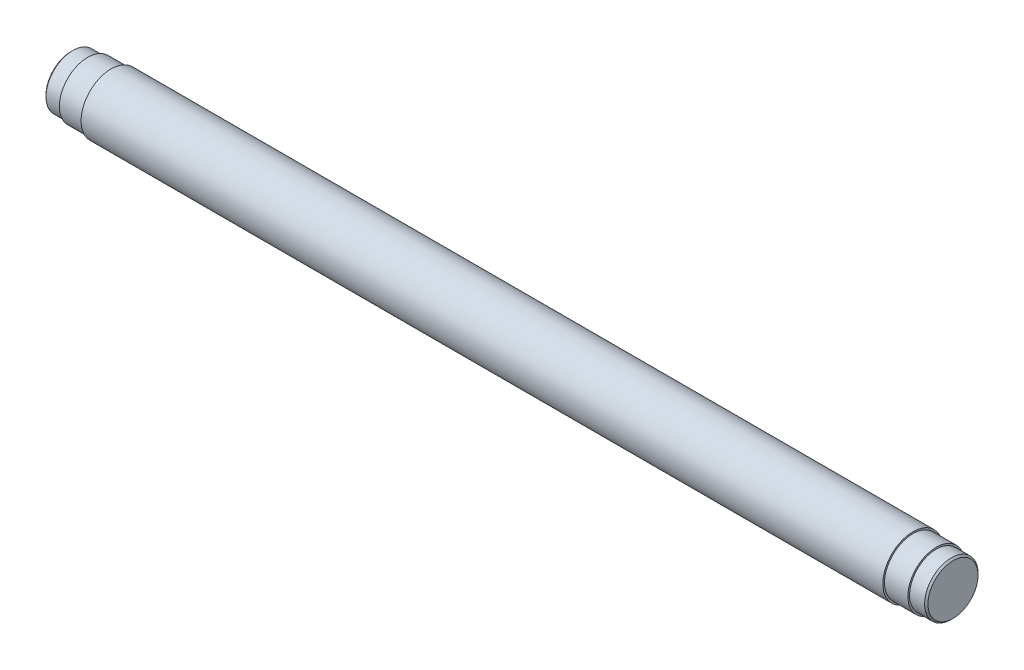
ISO-10303-21;
HEADER;
FILE_DESCRIPTION(('STEP AP214'),'2;1');
FILE_NAME('part.step','',(''),(''),'','','');
FILE_SCHEMA(('AUTOMOTIVE_DESIGN { 1 0 10303 214 1 1 1 1 }'));
ENDSEC;
DATA;
#1=APPLICATION_CONTEXT('core data for automotive mechanical design processes');
#2=APPLICATION_PROTOCOL_DEFINITION('international standard','automotive_design',2000,#1);
#3=PRODUCT_CONTEXT('',#1,'mechanical');
#4=PRODUCT('Part','Part','',(#3));
#5=PRODUCT_RELATED_PRODUCT_CATEGORY('part','',(#4));
#6=PRODUCT_DEFINITION_FORMATION('','',#4);
#7=PRODUCT_DEFINITION_CONTEXT('part definition',#1,'design');
#8=PRODUCT_DEFINITION('design','',#6,#7);
#9=PRODUCT_DEFINITION_SHAPE('','',#8);
#10=(LENGTH_UNIT() NAMED_UNIT(*) SI_UNIT(.MILLI.,.METRE.));
#11=(NAMED_UNIT(*) PLANE_ANGLE_UNIT() SI_UNIT($,.RADIAN.));
#12=(NAMED_UNIT(*) SI_UNIT($,.STERADIAN.) SOLID_ANGLE_UNIT());
#13=UNCERTAINTY_MEASURE_WITH_UNIT(LENGTH_MEASURE(1.E-05),#10,'distance_accuracy_value','');
#14=(GEOMETRIC_REPRESENTATION_CONTEXT(3) GLOBAL_UNCERTAINTY_ASSIGNED_CONTEXT((#13)) GLOBAL_UNIT_ASSIGNED_CONTEXT((#10,
#11,#12)) REPRESENTATION_CONTEXT('',''));
#15=CARTESIAN_POINT('',(0.,0.,0.));
#16=DIRECTION('',(0.,0.,1.));
#17=DIRECTION('',(1.,0.,0.));
#18=AXIS2_PLACEMENT_3D('',#15,#16,#17);
#19=CARTESIAN_POINT('',(0.,0.,0.));
#20=DIRECTION('',(1.,0.,0.));
#21=DIRECTION('',(0.,0.,-1.));
#22=AXIS2_PLACEMENT_3D('',#19,#20,#21);
#23=PLANE('',#22);
#24=CARTESIAN_POINT('',(0.,0.,0.));
#25=DIRECTION('',(1.,0.,0.));
#26=DIRECTION('',(0.,0.,-1.));
#27=AXIS2_PLACEMENT_3D('',#24,#25,#26);
#28=CIRCLE('',#27,7.50000000000006);
#29=CARTESIAN_POINT('',(0.,0.,-7.50000000000006));
#30=VERTEX_POINT('',#29);
#31=EDGE_CURVE('E39',#30,#30,#28,.F.);
#32=ORIENTED_EDGE('',*,*,#31,.T.);
#33=EDGE_LOOP('',(#32));
#34=FACE_BOUND('',#33,.T.);
#35=ADVANCED_FACE('F32',(#34),#23,.F.);
#36=CARTESIAN_POINT('',(-102.487167665038,0.,0.));
#37=DIRECTION('',(-1.,0.,0.));
#38=DIRECTION('',(0.,0.,1.));
#39=AXIS2_PLACEMENT_3D('',#36,#37,#38);
#40=CYLINDRICAL_SURFACE('',#39,8.00000000000001);
#41=CARTESIAN_POINT('',(0.499999999999973,0.,0.));
#42=DIRECTION('',(1.,0.,0.));
#43=DIRECTION('',(0.,0.,-1.));
#44=AXIS2_PLACEMENT_3D('',#41,#42,#43);
#45=CIRCLE('',#44,8.00000000000001);
#46=CARTESIAN_POINT('',(0.499999999999973,0.,-8.00000000000001));
#47=VERTEX_POINT('',#46);
#48=EDGE_CURVE('E10',#47,#47,#45,.T.);
#49=ORIENTED_EDGE('',*,*,#48,.T.);
#50=EDGE_LOOP('',(#49));
#51=FACE_BOUND('',#50,.T.);
#52=CARTESIAN_POINT('',(5.,0.,0.));
#53=DIRECTION('',(-1.,0.,0.));
#54=DIRECTION('',(0.,0.,1.));
#55=AXIS2_PLACEMENT_3D('',#52,#53,#54);
#56=CIRCLE('',#55,8.00000000000001);
#57=CARTESIAN_POINT('',(5.,0.,8.00000000000001));
#58=VERTEX_POINT('',#57);
#59=EDGE_CURVE('E52',#58,#58,#56,.T.);
#60=ORIENTED_EDGE('',*,*,#59,.T.);
#61=EDGE_LOOP('',(#60));
#62=FACE_BOUND('',#61,.T.);
#63=ADVANCED_FACE('F95',(#51,#62),#40,.T.);
#64=CARTESIAN_POINT('',(5.,0.,-8.00000000000001));
#65=DIRECTION('',(1.,0.,0.));
#66=DIRECTION('',(0.,0.,-1.));
#67=AXIS2_PLACEMENT_3D('',#64,#65,#66);
#68=PLANE('',#67);
#69=ORIENTED_EDGE('',*,*,#59,.F.);
#70=EDGE_LOOP('',(#69));
#71=FACE_BOUND('',#70,.T.);
#72=CARTESIAN_POINT('',(5.,0.,0.));
#73=DIRECTION('',(-1.,0.,0.));
#74=DIRECTION('',(0.,0.,1.));
#75=AXIS2_PLACEMENT_3D('',#72,#73,#74);
#76=CIRCLE('',#75,8.5);
#77=CARTESIAN_POINT('',(5.,0.,8.5));
#78=VERTEX_POINT('',#77);
#79=EDGE_CURVE('E55',#78,#78,#76,.T.);
#80=ORIENTED_EDGE('',*,*,#79,.T.);
#81=EDGE_LOOP('',(#80));
#82=FACE_BOUND('',#81,.T.);
#83=ADVANCED_FACE('F100',(#71,#82),#68,.F.);
#84=CARTESIAN_POINT('',(-102.487167665038,0.,0.));
#85=DIRECTION('',(-1.,0.,0.));
#86=DIRECTION('',(0.,0.,1.));
#87=AXIS2_PLACEMENT_3D('',#84,#85,#86);
#88=CYLINDRICAL_SURFACE('',#87,8.5);
#89=ORIENTED_EDGE('',*,*,#79,.F.);
#90=EDGE_LOOP('',(#89));
#91=FACE_BOUND('',#90,.T.);
#92=CARTESIAN_POINT('',(12.,0.,0.));
#93=DIRECTION('',(-1.,0.,0.));
#94=DIRECTION('',(0.,0.,1.));
#95=AXIS2_PLACEMENT_3D('',#92,#93,#94);
#96=CIRCLE('',#95,8.5);
#97=CARTESIAN_POINT('',(12.,0.,8.5));
#98=VERTEX_POINT('',#97);
#99=EDGE_CURVE('E58',#98,#98,#96,.T.);
#100=ORIENTED_EDGE('',*,*,#99,.T.);
#101=EDGE_LOOP('',(#100));
#102=FACE_BOUND('',#101,.T.);
#103=ADVANCED_FACE('F186',(#91,#102),#88,.T.);
#104=CARTESIAN_POINT('',(12.,0.,-8.5));
#105=DIRECTION('',(1.,0.,0.));
#106=DIRECTION('',(0.,0.,-1.));
#107=AXIS2_PLACEMENT_3D('',#104,#105,#106);
#108=PLANE('',#107);
#109=ORIENTED_EDGE('',*,*,#99,.F.);
#110=EDGE_LOOP('',(#109));
#111=FACE_BOUND('',#110,.T.);
#112=CARTESIAN_POINT('',(12.,0.,0.));
#113=DIRECTION('',(-1.,0.,0.));
#114=DIRECTION('',(0.,0.,1.));
#115=AXIS2_PLACEMENT_3D('',#112,#113,#114);
#116=CIRCLE('',#115,9.);
#117=CARTESIAN_POINT('',(12.,0.,9.));
#118=VERTEX_POINT('',#117);
#119=EDGE_CURVE('E61',#118,#118,#116,.T.);
#120=ORIENTED_EDGE('',*,*,#119,.T.);
#121=EDGE_LOOP('',(#120));
#122=FACE_BOUND('',#121,.T.);
#123=ADVANCED_FACE('F176',(#111,#122),#108,.F.);
#124=CARTESIAN_POINT('',(-102.487167665038,0.,0.));
#125=DIRECTION('',(-1.,0.,0.));
#126=DIRECTION('',(0.,0.,1.));
#127=AXIS2_PLACEMENT_3D('',#124,#125,#126);
#128=CYLINDRICAL_SURFACE('',#127,9.);
#129=ORIENTED_EDGE('',*,*,#119,.F.);
#130=EDGE_LOOP('',(#129));
#131=FACE_BOUND('',#130,.T.);
#132=CARTESIAN_POINT('',(252.,0.,0.));
#133=DIRECTION('',(-1.,0.,0.));
#134=DIRECTION('',(0.,0.,1.));
#135=AXIS2_PLACEMENT_3D('',#132,#133,#134);
#136=CIRCLE('',#135,9.);
#137=CARTESIAN_POINT('',(252.,0.,9.));
#138=VERTEX_POINT('',#137);
#139=EDGE_CURVE('E64',#138,#138,#136,.T.);
#140=ORIENTED_EDGE('',*,*,#139,.T.);
#141=EDGE_LOOP('',(#140));
#142=FACE_BOUND('',#141,.T.);
#143=ADVANCED_FACE('F166',(#131,#142),#128,.T.);
#144=CARTESIAN_POINT('',(252.,0.,-9.));
#145=DIRECTION('',(-1.,0.,0.));
#146=DIRECTION('',(0.,0.,1.));
#147=AXIS2_PLACEMENT_3D('',#144,#145,#146);
#148=PLANE('',#147);
#149=ORIENTED_EDGE('',*,*,#139,.F.);
#150=EDGE_LOOP('',(#149));
#151=FACE_BOUND('',#150,.T.);
#152=CARTESIAN_POINT('',(252.,0.,0.));
#153=DIRECTION('',(-1.,0.,0.));
#154=DIRECTION('',(0.,0.,1.));
#155=AXIS2_PLACEMENT_3D('',#152,#153,#154);
#156=CIRCLE('',#155,8.5);
#157=CARTESIAN_POINT('',(252.,0.,8.5));
#158=VERTEX_POINT('',#157);
#159=EDGE_CURVE('E67',#158,#158,#156,.T.);
#160=ORIENTED_EDGE('',*,*,#159,.T.);
#161=EDGE_LOOP('',(#160));
#162=FACE_BOUND('',#161,.T.);
#163=ADVANCED_FACE('F156',(#151,#162),#148,.F.);
#164=CARTESIAN_POINT('',(-102.487167665038,0.,0.));
#165=DIRECTION('',(-1.,0.,0.));
#166=DIRECTION('',(0.,0.,1.));
#167=AXIS2_PLACEMENT_3D('',#164,#165,#166);
#168=CYLINDRICAL_SURFACE('',#167,8.5);
#169=ORIENTED_EDGE('',*,*,#159,.F.);
#170=EDGE_LOOP('',(#169));
#171=FACE_BOUND('',#170,.T.);
#172=CARTESIAN_POINT('',(259.,0.,0.));
#173=DIRECTION('',(-1.,0.,0.));
#174=DIRECTION('',(0.,0.,1.));
#175=AXIS2_PLACEMENT_3D('',#172,#173,#174);
#176=CIRCLE('',#175,8.5);
#177=CARTESIAN_POINT('',(259.,0.,8.5));
#178=VERTEX_POINT('',#177);
#179=EDGE_CURVE('E70',#178,#178,#176,.T.);
#180=ORIENTED_EDGE('',*,*,#179,.T.);
#181=EDGE_LOOP('',(#180));
#182=FACE_BOUND('',#181,.T.);
#183=ADVANCED_FACE('F91',(#171,#182),#168,.T.);
#184=CARTESIAN_POINT('',(259.,0.,-8.5));
#185=DIRECTION('',(-1.,0.,0.));
#186=DIRECTION('',(0.,0.,1.));
#187=AXIS2_PLACEMENT_3D('',#184,#185,#186);
#188=PLANE('',#187);
#189=ORIENTED_EDGE('',*,*,#179,.F.);
#190=EDGE_LOOP('',(#189));
#191=FACE_BOUND('',#190,.T.);
#192=CARTESIAN_POINT('',(259.,0.,0.));
#193=DIRECTION('',(-1.,0.,0.));
#194=DIRECTION('',(0.,0.,1.));
#195=AXIS2_PLACEMENT_3D('',#192,#193,#194);
#196=CIRCLE('',#195,8.00000000000001);
#197=CARTESIAN_POINT('',(259.,0.,8.00000000000001));
#198=VERTEX_POINT('',#197);
#199=EDGE_CURVE('E73',#198,#198,#196,.T.);
#200=ORIENTED_EDGE('',*,*,#199,.T.);
#201=EDGE_LOOP('',(#200));
#202=FACE_BOUND('',#201,.T.);
#203=ADVANCED_FACE('F77',(#191,#202),#188,.F.);
#204=CARTESIAN_POINT('',(-102.487167665038,0.,0.));
#205=DIRECTION('',(-1.,0.,0.));
#206=DIRECTION('',(0.,0.,1.));
#207=AXIS2_PLACEMENT_3D('',#204,#205,#206);
#208=CYLINDRICAL_SURFACE('',#207,8.00000000000001);
#209=CARTESIAN_POINT('',(263.5,0.,0.));
#210=DIRECTION('',(-1.,0.,0.));
#211=DIRECTION('',(0.,0.,1.));
#212=AXIS2_PLACEMENT_3D('',#209,#210,#211);
#213=CIRCLE('',#212,8.00000000000001);
#214=CARTESIAN_POINT('',(263.5,0.,8.00000000000001));
#215=VERTEX_POINT('',#214);
#216=EDGE_CURVE('E47',#215,#215,#213,.T.);
#217=ORIENTED_EDGE('',*,*,#216,.T.);
#218=EDGE_LOOP('',(#217));
#219=FACE_BOUND('',#218,.T.);
#220=ORIENTED_EDGE('',*,*,#199,.F.);
#221=EDGE_LOOP('',(#220));
#222=FACE_BOUND('',#221,.T.);
#223=ADVANCED_FACE('F79',(#219,#222),#208,.T.);
#224=CARTESIAN_POINT('',(264.,0.,-8.00000000000001));
#225=DIRECTION('',(-1.,0.,0.));
#226=DIRECTION('',(0.,0.,1.));
#227=AXIS2_PLACEMENT_3D('',#224,#225,#226);
#228=PLANE('',#227);
#229=CARTESIAN_POINT('',(264.,0.,0.));
#230=DIRECTION('',(-1.,0.,0.));
#231=DIRECTION('',(0.,0.,1.));
#232=AXIS2_PLACEMENT_3D('',#229,#230,#231);
#233=CIRCLE('',#232,7.49999999999992);
#234=CARTESIAN_POINT('',(264.,0.,7.49999999999992));
#235=VERTEX_POINT('',#234);
#236=EDGE_CURVE('E43',#235,#235,#233,.F.);
#237=ORIENTED_EDGE('',*,*,#236,.T.);
#238=EDGE_LOOP('',(#237));
#239=FACE_BOUND('',#238,.T.);
#240=ADVANCED_FACE('F81',(#239),#228,.F.);
#241=CARTESIAN_POINT('',(263.5,0.,0.));
#242=DIRECTION('',(-1.,0.,0.));
#243=DIRECTION('',(0.,0.,1.));
#244=AXIS2_PLACEMENT_3D('',#241,#242,#243);
#245=CONICAL_SURFACE('',#244,8.00000000000001,0.785398163397476);
#246=ORIENTED_EDGE('',*,*,#236,.F.);
#247=EDGE_LOOP('',(#246));
#248=FACE_BOUND('',#247,.T.);
#249=ORIENTED_EDGE('',*,*,#216,.F.);
#250=EDGE_LOOP('',(#249));
#251=FACE_BOUND('',#250,.T.);
#252=ADVANCED_FACE('F88',(#248,#251),#245,.T.);
#253=CARTESIAN_POINT('',(0.,0.,0.));
#254=DIRECTION('',(1.,0.,0.));
#255=DIRECTION('',(0.,0.,-1.));
#256=AXIS2_PLACEMENT_3D('',#253,#254,#255);
#257=CONICAL_SURFACE('',#256,7.50000000000006,0.785398163397421);
#258=ORIENTED_EDGE('',*,*,#48,.F.);
#259=EDGE_LOOP('',(#258));
#260=FACE_BOUND('',#259,.T.);
#261=ORIENTED_EDGE('',*,*,#31,.F.);
#262=EDGE_LOOP('',(#261));
#263=FACE_BOUND('',#262,.T.);
#264=ADVANCED_FACE('F34',(#260,#263),#257,.T.);
#265=CLOSED_SHELL('',(#35,#63,#83,#103,#123,#143,#163,#183,#203,#223,#240,#252,#264));
#266=MANIFOLD_SOLID_BREP('B2',#265);
#267=ADVANCED_BREP_SHAPE_REPRESENTATION('',(#18,#266),#14);
#268=SHAPE_DEFINITION_REPRESENTATION(#9,#267);
ENDSEC;
END-ISO-10303-21;
